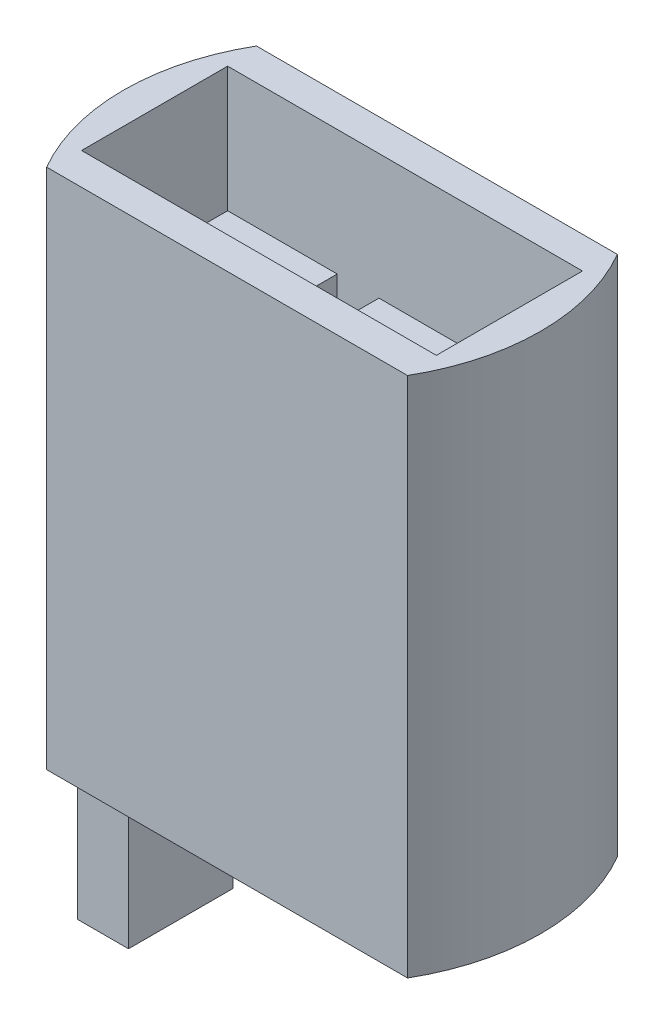
ISO-10303-21;
HEADER;
FILE_DESCRIPTION(('STEP AP214'),'2;1');
FILE_NAME('part.step','',(''),(''),'','','');
FILE_SCHEMA(('AUTOMOTIVE_DESIGN { 1 0 10303 214 1 1 1 1 }'));
ENDSEC;
DATA;
#1=APPLICATION_CONTEXT('core data for automotive mechanical design processes');
#2=APPLICATION_PROTOCOL_DEFINITION('international standard','automotive_design',2000,#1);
#3=PRODUCT_CONTEXT('',#1,'mechanical');
#4=PRODUCT('Part','Part','',(#3));
#5=PRODUCT_RELATED_PRODUCT_CATEGORY('part','',(#4));
#6=PRODUCT_DEFINITION_FORMATION('','',#4);
#7=PRODUCT_DEFINITION_CONTEXT('part definition',#1,'design');
#8=PRODUCT_DEFINITION('design','',#6,#7);
#9=PRODUCT_DEFINITION_SHAPE('','',#8);
#10=(LENGTH_UNIT() NAMED_UNIT(*) SI_UNIT(.MILLI.,.METRE.));
#11=(NAMED_UNIT(*) PLANE_ANGLE_UNIT() SI_UNIT($,.RADIAN.));
#12=(NAMED_UNIT(*) SI_UNIT($,.STERADIAN.) SOLID_ANGLE_UNIT());
#13=UNCERTAINTY_MEASURE_WITH_UNIT(LENGTH_MEASURE(1.E-05),#10,'distance_accuracy_value','');
#14=(GEOMETRIC_REPRESENTATION_CONTEXT(3) GLOBAL_UNCERTAINTY_ASSIGNED_CONTEXT((#13)) GLOBAL_UNIT_ASSIGNED_CONTEXT((#10,
#11,#12)) REPRESENTATION_CONTEXT('',''));
#15=CARTESIAN_POINT('',(0.,0.,0.));
#16=DIRECTION('',(0.,0.,1.));
#17=DIRECTION('',(1.,0.,0.));
#18=AXIS2_PLACEMENT_3D('',#15,#16,#17);
#19=CARTESIAN_POINT('',(-8.05,-8.,-2.5));
#20=DIRECTION('',(1.,0.,0.));
#21=DIRECTION('',(0.,0.,-1.));
#22=AXIS2_PLACEMENT_3D('',#19,#20,#21);
#23=PLANE('',#22);
#24=DIRECTION('',(0.,-1.,0.));
#25=VECTOR('',#24,1.);
#26=CARTESIAN_POINT('',(-8.05,-8.,1.5));
#27=LINE('',#26,#25);
#28=CARTESIAN_POINT('',(-8.05,-0.75,1.5));
#29=VERTEX_POINT('',#28);
#30=CARTESIAN_POINT('',(-8.05,-8.,1.5));
#31=VERTEX_POINT('',#30);
#32=EDGE_CURVE('E56',#29,#31,#27,.T.);
#33=ORIENTED_EDGE('',*,*,#32,.F.);
#34=DIRECTION('',(0.,0.,1.));
#35=VECTOR('',#34,1.);
#36=CARTESIAN_POINT('',(-8.05,-0.75,1.5));
#37=LINE('',#36,#35);
#38=CARTESIAN_POINT('',(-8.05,-0.75,-1.5));
#39=VERTEX_POINT('',#38);
#40=EDGE_CURVE('E464',#39,#29,#37,.T.);
#41=ORIENTED_EDGE('',*,*,#40,.F.);
#42=DIRECTION('',(0.,1.,0.));
#43=VECTOR('',#42,1.);
#44=CARTESIAN_POINT('',(-8.05,-0.75,-1.5));
#45=LINE('',#44,#43);
#46=CARTESIAN_POINT('',(-8.05,-8.,-1.5));
#47=VERTEX_POINT('',#46);
#48=EDGE_CURVE('E61',#47,#39,#45,.T.);
#49=ORIENTED_EDGE('',*,*,#48,.F.);
#50=DIRECTION('',(0.,0.,-1.));
#51=VECTOR('',#50,1.);
#52=CARTESIAN_POINT('',(-8.05,-8.,-2.5));
#53=LINE('',#52,#51);
#54=EDGE_CURVE('E203',#31,#47,#53,.T.);
#55=ORIENTED_EDGE('',*,*,#54,.F.);
#56=EDGE_LOOP('',(#33,#41,#49,#55));
#57=FACE_BOUND('',#56,.T.);
#58=ADVANCED_FACE('F41',(#57),#23,.F.);
#59=CARTESIAN_POINT('',(-8.05,-8.,-2.5));
#60=DIRECTION('',(0.,0.,1.));
#61=DIRECTION('',(1.,0.,0.));
#62=AXIS2_PLACEMENT_3D('',#59,#60,#61);
#63=PLANE('',#62);
#64=DIRECTION('',(1.,0.,0.));
#65=VECTOR('',#64,1.);
#66=CARTESIAN_POINT('',(-8.05,-8.,-2.5));
#67=LINE('',#66,#65);
#68=CARTESIAN_POINT('',(-9.68245836551854,-8.,-2.5));
#69=VERTEX_POINT('',#68);
#70=CARTESIAN_POINT('',(-7.25,-8.,-2.5));
#71=VERTEX_POINT('',#70);
#72=EDGE_CURVE('E193',#69,#71,#67,.T.);
#73=ORIENTED_EDGE('',*,*,#72,.F.);
#74=DIRECTION('',(0.,1.,0.));
#75=VECTOR('',#74,1.);
#76=CARTESIAN_POINT('',(-9.68245836551854,-8.001,-2.5));
#77=LINE('',#76,#75);
#78=CARTESIAN_POINT('',(-9.68245836551854,0.,-2.5));
#79=VERTEX_POINT('',#78);
#80=EDGE_CURVE('E176',#69,#79,#77,.T.);
#81=ORIENTED_EDGE('',*,*,#80,.T.);
#82=DIRECTION('',(1.,0.,0.));
#83=VECTOR('',#82,1.);
#84=CARTESIAN_POINT('',(-8.05,0.,-2.5));
#85=LINE('',#84,#83);
#86=CARTESIAN_POINT('',(-7.25,0.,-2.5));
#87=VERTEX_POINT('',#86);
#88=EDGE_CURVE('E214',#79,#87,#85,.T.);
#89=ORIENTED_EDGE('',*,*,#88,.T.);
#90=DIRECTION('',(0.,1.,0.));
#91=VECTOR('',#90,1.);
#92=CARTESIAN_POINT('',(-7.25,-8.,-2.5));
#93=LINE('',#92,#91);
#94=EDGE_CURVE('E11',#71,#87,#93,.T.);
#95=ORIENTED_EDGE('',*,*,#94,.F.);
#96=EDGE_LOOP('',(#73,#81,#89,#95));
#97=FACE_BOUND('',#96,.T.);
#98=ADVANCED_FACE('F199',(#97),#63,.F.);
#99=CARTESIAN_POINT('',(-7.25,-8.,-2.5));
#100=DIRECTION('',(-1.,0.,0.));
#101=DIRECTION('',(0.,0.,1.));
#102=AXIS2_PLACEMENT_3D('',#99,#100,#101);
#103=PLANE('',#102);
#104=DIRECTION('',(0.,0.,1.));
#105=VECTOR('',#104,1.);
#106=CARTESIAN_POINT('',(-7.25,0.,-2.5));
#107=LINE('',#106,#105);
#108=CARTESIAN_POINT('',(-7.25,0.,2.5));
#109=VERTEX_POINT('',#108);
#110=EDGE_CURVE('E217',#87,#109,#107,.T.);
#111=ORIENTED_EDGE('',*,*,#110,.T.);
#112=DIRECTION('',(0.,1.,0.));
#113=VECTOR('',#112,1.);
#114=CARTESIAN_POINT('',(-7.25,-8.,2.5));
#115=LINE('',#114,#113);
#116=CARTESIAN_POINT('',(-7.25,-8.,2.5));
#117=VERTEX_POINT('',#116);
#118=EDGE_CURVE('E49',#117,#109,#115,.T.);
#119=ORIENTED_EDGE('',*,*,#118,.F.);
#120=DIRECTION('',(0.,0.,1.));
#121=VECTOR('',#120,1.);
#122=CARTESIAN_POINT('',(-7.25,-8.,-2.5));
#123=LINE('',#122,#121);
#124=EDGE_CURVE('E202',#71,#117,#123,.T.);
#125=ORIENTED_EDGE('',*,*,#124,.F.);
#126=ORIENTED_EDGE('',*,*,#94,.T.);
#127=EDGE_LOOP('',(#111,#119,#125,#126));
#128=FACE_BOUND('',#127,.T.);
#129=ADVANCED_FACE('F423',(#128),#103,.F.);
#130=CARTESIAN_POINT('',(-8.05,-8.,2.5));
#131=DIRECTION('',(0.,0.,-1.));
#132=DIRECTION('',(-1.,0.,0.));
#133=AXIS2_PLACEMENT_3D('',#130,#131,#132);
#134=PLANE('',#133);
#135=DIRECTION('',(-1.,0.,0.));
#136=VECTOR('',#135,1.);
#137=CARTESIAN_POINT('',(-8.05,0.,2.5));
#138=LINE('',#137,#136);
#139=CARTESIAN_POINT('',(-9.68245836551854,0.,2.5));
#140=VERTEX_POINT('',#139);
#141=EDGE_CURVE('E208',#109,#140,#138,.T.);
#142=ORIENTED_EDGE('',*,*,#141,.T.);
#143=DIRECTION('',(0.,1.,0.));
#144=VECTOR('',#143,1.);
#145=CARTESIAN_POINT('',(-9.68245836551854,-8.001,2.5));
#146=LINE('',#145,#144);
#147=CARTESIAN_POINT('',(-9.68245836551854,-8.,2.5));
#148=VERTEX_POINT('',#147);
#149=EDGE_CURVE('E188',#148,#140,#146,.T.);
#150=ORIENTED_EDGE('',*,*,#149,.F.);
#151=DIRECTION('',(-1.,0.,0.));
#152=VECTOR('',#151,1.);
#153=CARTESIAN_POINT('',(-8.05,-8.,2.5));
#154=LINE('',#153,#152);
#155=EDGE_CURVE('E196',#117,#148,#154,.T.);
#156=ORIENTED_EDGE('',*,*,#155,.F.);
#157=ORIENTED_EDGE('',*,*,#118,.T.);
#158=EDGE_LOOP('',(#142,#150,#156,#157));
#159=FACE_BOUND('',#158,.T.);
#160=ADVANCED_FACE('F228',(#159),#134,.F.);
#161=CARTESIAN_POINT('',(0.,-8.,0.));
#162=DIRECTION('',(0.,1.,0.));
#163=DIRECTION('',(0.,0.,1.));
#164=AXIS2_PLACEMENT_3D('',#161,#162,#163);
#165=PLANE('',#164);
#166=DIRECTION('',(1.,0.,0.));
#167=VECTOR('',#166,1.);
#168=CARTESIAN_POINT('',(-9.25,-8.,-1.5));
#169=LINE('',#168,#167);
#170=CARTESIAN_POINT('',(-9.25,-8.,-1.5));
#171=VERTEX_POINT('',#170);
#172=EDGE_CURVE('E218',#171,#47,#169,.T.);
#173=ORIENTED_EDGE('',*,*,#172,.F.);
#174=DIRECTION('',(0.,0.,1.));
#175=VECTOR('',#174,1.);
#176=CARTESIAN_POINT('',(-9.25,-8.,-2.5));
#177=LINE('',#176,#175);
#178=CARTESIAN_POINT('',(-9.25,-8.,1.5));
#179=VERTEX_POINT('',#178);
#180=EDGE_CURVE('E265',#171,#179,#177,.T.);
#181=ORIENTED_EDGE('',*,*,#180,.T.);
#182=DIRECTION('',(1.,0.,0.));
#183=VECTOR('',#182,1.);
#184=CARTESIAN_POINT('',(-9.25,-8.,1.5));
#185=LINE('',#184,#183);
#186=EDGE_CURVE('E473',#179,#31,#185,.T.);
#187=ORIENTED_EDGE('',*,*,#186,.T.);
#188=ORIENTED_EDGE('',*,*,#54,.T.);
#189=EDGE_LOOP('',(#173,#181,#187,#188));
#190=FACE_BOUND('',#189,.T.);
#191=ORIENTED_EDGE('',*,*,#155,.T.);
#192=CARTESIAN_POINT('',(-6.26235174827627E-13,-8.,0.));
#193=DIRECTION('',(0.,1.,0.));
#194=DIRECTION('',(0.,0.,1.));
#195=AXIS2_PLACEMENT_3D('',#192,#193,#194);
#196=CIRCLE('',#195,9.99999999999939);
#197=EDGE_CURVE('E179',#69,#148,#196,.T.);
#198=ORIENTED_EDGE('',*,*,#197,.F.);
#199=ORIENTED_EDGE('',*,*,#72,.T.);
#200=ORIENTED_EDGE('',*,*,#124,.T.);
#201=EDGE_LOOP('',(#191,#198,#199,#200));
#202=FACE_BOUND('',#201,.T.);
#203=ADVANCED_FACE('F192',(#190,#202),#165,.F.);
#204=CARTESIAN_POINT('',(-9.25,-0.75,-1.5));
#205=DIRECTION('',(0.,0.,-1.));
#206=DIRECTION('',(0.,1.,0.));
#207=AXIS2_PLACEMENT_3D('',#204,#205,#206);
#208=PLANE('',#207);
#209=ORIENTED_EDGE('',*,*,#48,.T.);
#210=DIRECTION('',(1.,0.,0.));
#211=VECTOR('',#210,1.);
#212=CARTESIAN_POINT('',(-9.25,-0.75,-1.5));
#213=LINE('',#212,#211);
#214=CARTESIAN_POINT('',(-9.25,-0.75,-1.5));
#215=VERTEX_POINT('',#214);
#216=EDGE_CURVE('E485',#215,#39,#213,.T.);
#217=ORIENTED_EDGE('',*,*,#216,.F.);
#218=DIRECTION('',(0.,1.,0.));
#219=VECTOR('',#218,1.);
#220=CARTESIAN_POINT('',(-9.25,-0.75,-1.5));
#221=LINE('',#220,#219);
#222=EDGE_CURVE('E457',#171,#215,#221,.T.);
#223=ORIENTED_EDGE('',*,*,#222,.F.);
#224=ORIENTED_EDGE('',*,*,#172,.T.);
#225=EDGE_LOOP('',(#209,#217,#223,#224));
#226=FACE_BOUND('',#225,.T.);
#227=ADVANCED_FACE('F433',(#226),#208,.F.);
#228=CARTESIAN_POINT('',(-9.25,-0.75,1.5));
#229=DIRECTION('',(0.,1.,0.));
#230=DIRECTION('',(0.,0.,1.));
#231=AXIS2_PLACEMENT_3D('',#228,#229,#230);
#232=PLANE('',#231);
#233=ORIENTED_EDGE('',*,*,#40,.T.);
#234=DIRECTION('',(1.,0.,0.));
#235=VECTOR('',#234,1.);
#236=CARTESIAN_POINT('',(-9.25,-0.75,1.5));
#237=LINE('',#236,#235);
#238=CARTESIAN_POINT('',(-9.25,-0.75,1.5));
#239=VERTEX_POINT('',#238);
#240=EDGE_CURVE('E481',#239,#29,#237,.T.);
#241=ORIENTED_EDGE('',*,*,#240,.F.);
#242=DIRECTION('',(0.,0.,1.));
#243=VECTOR('',#242,1.);
#244=CARTESIAN_POINT('',(-9.25,-0.75,1.5));
#245=LINE('',#244,#243);
#246=EDGE_CURVE('E469',#215,#239,#245,.T.);
#247=ORIENTED_EDGE('',*,*,#246,.F.);
#248=ORIENTED_EDGE('',*,*,#216,.T.);
#249=EDGE_LOOP('',(#233,#241,#247,#248));
#250=FACE_BOUND('',#249,.T.);
#251=ADVANCED_FACE('F437',(#250),#232,.F.);
#252=CARTESIAN_POINT('',(-9.25,-8.,1.5));
#253=DIRECTION('',(0.,0.,1.));
#254=DIRECTION('',(1.,0.,0.));
#255=AXIS2_PLACEMENT_3D('',#252,#253,#254);
#256=PLANE('',#255);
#257=ORIENTED_EDGE('',*,*,#32,.T.);
#258=ORIENTED_EDGE('',*,*,#186,.F.);
#259=DIRECTION('',(0.,-1.,0.));
#260=VECTOR('',#259,1.);
#261=CARTESIAN_POINT('',(-9.25,-8.,1.5));
#262=LINE('',#261,#260);
#263=EDGE_CURVE('E459',#239,#179,#262,.T.);
#264=ORIENTED_EDGE('',*,*,#263,.F.);
#265=ORIENTED_EDGE('',*,*,#240,.T.);
#266=EDGE_LOOP('',(#257,#258,#264,#265));
#267=FACE_BOUND('',#266,.T.);
#268=ADVANCED_FACE('F441',(#267),#256,.F.);
#269=CARTESIAN_POINT('',(-9.25,0.,0.));
#270=DIRECTION('',(1.,0.,0.));
#271=DIRECTION('',(0.,0.,-1.));
#272=AXIS2_PLACEMENT_3D('',#269,#270,#271);
#273=PLANE('',#272);
#274=ORIENTED_EDGE('',*,*,#180,.F.);
#275=ORIENTED_EDGE('',*,*,#222,.T.);
#276=ORIENTED_EDGE('',*,*,#246,.T.);
#277=ORIENTED_EDGE('',*,*,#263,.T.);
#278=EDGE_LOOP('',(#274,#275,#276,#277));
#279=FACE_BOUND('',#278,.T.);
#280=ADVANCED_FACE('F445',(#279),#273,.T.);
#281=CARTESIAN_POINT('',(0.,25.,0.));
#282=DIRECTION('',(0.,-1.,0.));
#283=DIRECTION('',(0.,0.,-1.));
#284=AXIS2_PLACEMENT_3D('',#281,#282,#283);
#285=CYLINDRICAL_SURFACE('',#284,10.);
#286=CARTESIAN_POINT('',(0.,25.,0.));
#287=DIRECTION('',(0.,1.,0.));
#288=DIRECTION('',(0.,0.,1.));
#289=AXIS2_PLACEMENT_3D('',#286,#287,#288);
#290=CIRCLE('',#289,10.);
#291=CARTESIAN_POINT('',(8.64463271574625,25.,5.02695983770008));
#292=VERTEX_POINT('',#291);
#293=CARTESIAN_POINT('',(8.64463271574627,25.,-5.02695983770008));
#294=VERTEX_POINT('',#293);
#295=EDGE_CURVE('E258',#292,#294,#290,.T.);
#296=ORIENTED_EDGE('',*,*,#295,.F.);
#297=DIRECTION('',(0.,-1.,0.));
#298=VECTOR('',#297,1.);
#299=CARTESIAN_POINT('',(8.64463271574625,25.,5.02695983770008));
#300=LINE('',#299,#298);
#301=CARTESIAN_POINT('',(8.64463271574625,0.,5.02695983770008));
#302=VERTEX_POINT('',#301);
#303=EDGE_CURVE('E331',#292,#302,#300,.T.);
#304=ORIENTED_EDGE('',*,*,#303,.T.);
#305=CARTESIAN_POINT('',(0.,0.,0.));
#306=DIRECTION('',(0.,1.,0.));
#307=DIRECTION('',(0.,0.,1.));
#308=AXIS2_PLACEMENT_3D('',#305,#306,#307);
#309=CIRCLE('',#308,10.);
#310=CARTESIAN_POINT('',(8.64463271574625,0.,-5.02695983770008));
#311=VERTEX_POINT('',#310);
#312=EDGE_CURVE('E243',#302,#311,#309,.T.);
#313=ORIENTED_EDGE('',*,*,#312,.T.);
#314=DIRECTION('',(0.,-1.,0.));
#315=VECTOR('',#314,1.);
#316=CARTESIAN_POINT('',(8.64463271574627,25.,-5.02695983770008));
#317=LINE('',#316,#315);
#318=EDGE_CURVE('E346',#294,#311,#317,.T.);
#319=ORIENTED_EDGE('',*,*,#318,.F.);
#320=EDGE_LOOP('',(#296,#304,#313,#319));
#321=FACE_BOUND('',#320,.T.);
#322=ADVANCED_FACE('F417',(#321),#285,.T.);
#323=CARTESIAN_POINT('',(0.,19.,0.));
#324=DIRECTION('',(0.,-1.,0.));
#325=DIRECTION('',(0.,0.,-1.));
#326=AXIS2_PLACEMENT_3D('',#323,#324,#325);
#327=PLANE('',#326);
#328=DIRECTION('',(0.,0.,-1.));
#329=VECTOR('',#328,1.);
#330=CARTESIAN_POINT('',(-1.25,19.,-3.5));
#331=LINE('',#330,#329);
#332=CARTESIAN_POINT('',(-1.25,19.,3.5));
#333=VERTEX_POINT('',#332);
#334=CARTESIAN_POINT('',(-1.25,19.,-3.5));
#335=VERTEX_POINT('',#334);
#336=EDGE_CURVE('E327',#333,#335,#331,.T.);
#337=ORIENTED_EDGE('',*,*,#336,.F.);
#338=DIRECTION('',(1.,0.,0.));
#339=VECTOR('',#338,1.);
#340=CARTESIAN_POINT('',(-8.5,19.,3.5));
#341=LINE('',#340,#339);
#342=CARTESIAN_POINT('',(8.5,19.,3.5));
#343=VERTEX_POINT('',#342);
#344=EDGE_CURVE('E306',#333,#343,#341,.T.);
#345=ORIENTED_EDGE('',*,*,#344,.T.);
#346=DIRECTION('',(0.,0.,-1.));
#347=VECTOR('',#346,1.);
#348=CARTESIAN_POINT('',(8.5,19.,3.5));
#349=LINE('',#348,#347);
#350=CARTESIAN_POINT('',(8.5,19.,-3.5));
#351=VERTEX_POINT('',#350);
#352=EDGE_CURVE('E298',#343,#351,#349,.T.);
#353=ORIENTED_EDGE('',*,*,#352,.T.);
#354=DIRECTION('',(-1.,0.,0.));
#355=VECTOR('',#354,1.);
#356=CARTESIAN_POINT('',(-8.5,19.,-3.5));
#357=LINE('',#356,#355);
#358=EDGE_CURVE('E272',#351,#335,#357,.T.);
#359=ORIENTED_EDGE('',*,*,#358,.T.);
#360=EDGE_LOOP('',(#337,#345,#353,#359));
#361=FACE_BOUND('',#360,.T.);
#362=ADVANCED_FACE('F401',(#361),#327,.F.);
#363=DIRECTION('',(0.,0.,1.));
#364=VECTOR('',#363,1.);
#365=CARTESIAN_POINT('',(-3.25,19.,-3.5));
#366=LINE('',#365,#364);
#367=CARTESIAN_POINT('',(-3.25,19.,-3.5));
#368=VERTEX_POINT('',#367);
#369=CARTESIAN_POINT('',(-3.25,19.,3.5));
#370=VERTEX_POINT('',#369);
#371=EDGE_CURVE('E322',#368,#370,#366,.T.);
#372=ORIENTED_EDGE('',*,*,#371,.F.);
#373=CARTESIAN_POINT('',(-8.5,19.,-3.5));
#374=VERTEX_POINT('',#373);
#375=EDGE_CURVE('E297',#368,#374,#357,.T.);
#376=ORIENTED_EDGE('',*,*,#375,.T.);
#377=DIRECTION('',(0.,0.,1.));
#378=VECTOR('',#377,1.);
#379=CARTESIAN_POINT('',(-8.5,19.,3.5));
#380=LINE('',#379,#378);
#381=CARTESIAN_POINT('',(-8.5,19.,3.5));
#382=VERTEX_POINT('',#381);
#383=EDGE_CURVE('E281',#374,#382,#380,.T.);
#384=ORIENTED_EDGE('',*,*,#383,.T.);
#385=EDGE_CURVE('E302',#382,#370,#341,.T.);
#386=ORIENTED_EDGE('',*,*,#385,.T.);
#387=EDGE_LOOP('',(#372,#376,#384,#386));
#388=FACE_BOUND('',#387,.T.);
#389=ADVANCED_FACE('F375',(#388),#327,.F.);
#390=CARTESIAN_POINT('',(-8.64463271574623,0.,-5.02695983770015));
#391=VERTEX_POINT('',#390);
#392=EDGE_CURVE('E183',#391,#79,#309,.T.);
#393=ORIENTED_EDGE('',*,*,#392,.T.);
#394=ORIENTED_EDGE('',*,*,#80,.F.);
#395=ORIENTED_EDGE('',*,*,#197,.T.);
#396=ORIENTED_EDGE('',*,*,#149,.T.);
#397=CARTESIAN_POINT('',(-8.64463271574625,0.,5.02695983770008));
#398=VERTEX_POINT('',#397);
#399=EDGE_CURVE('E235',#140,#398,#309,.T.);
#400=ORIENTED_EDGE('',*,*,#399,.T.);
#401=DIRECTION('',(0.,-1.,0.));
#402=VECTOR('',#401,1.);
#403=CARTESIAN_POINT('',(-8.64463271574625,25.,5.02695983770008));
#404=LINE('',#403,#402);
#405=CARTESIAN_POINT('',(-8.64463271574625,25.,5.02695983770008));
#406=VERTEX_POINT('',#405);
#407=EDGE_CURVE('E358',#406,#398,#404,.T.);
#408=ORIENTED_EDGE('',*,*,#407,.F.);
#409=CARTESIAN_POINT('',(-8.64463271574623,25.,-5.02695983770015));
#410=VERTEX_POINT('',#409);
#411=EDGE_CURVE('E252',#410,#406,#290,.T.);
#412=ORIENTED_EDGE('',*,*,#411,.F.);
#413=DIRECTION('',(0.,-1.,0.));
#414=VECTOR('',#413,1.);
#415=CARTESIAN_POINT('',(-8.64463271574623,25.,-5.02695983770015));
#416=LINE('',#415,#414);
#417=EDGE_CURVE('E349',#410,#391,#416,.T.);
#418=ORIENTED_EDGE('',*,*,#417,.T.);
#419=EDGE_LOOP('',(#393,#394,#395,#396,#400,#408,#412,#418));
#420=FACE_BOUND('',#419,.T.);
#421=ADVANCED_FACE('F178',(#420),#285,.T.);
#422=CARTESIAN_POINT('',(0.,25.,0.));
#423=DIRECTION('',(0.,1.,0.));
#424=DIRECTION('',(0.,0.,1.));
#425=AXIS2_PLACEMENT_3D('',#422,#423,#424);
#426=PLANE('',#425);
#427=DIRECTION('',(1.,0.,0.));
#428=VECTOR('',#427,1.);
#429=CARTESIAN_POINT('',(-8.64463271574625,25.,5.02695983770008));
#430=LINE('',#429,#428);
#431=EDGE_CURVE('E361',#406,#292,#430,.T.);
#432=ORIENTED_EDGE('',*,*,#431,.T.);
#433=ORIENTED_EDGE('',*,*,#295,.T.);
#434=DIRECTION('',(-1.,0.,0.));
#435=VECTOR('',#434,1.);
#436=CARTESIAN_POINT('',(-8.64463271574623,25.,-5.02695983770015));
#437=LINE('',#436,#435);
#438=EDGE_CURVE('E350',#294,#410,#437,.T.);
#439=ORIENTED_EDGE('',*,*,#438,.T.);
#440=ORIENTED_EDGE('',*,*,#411,.T.);
#441=EDGE_LOOP('',(#432,#433,#439,#440));
#442=FACE_BOUND('',#441,.T.);
#443=DIRECTION('',(0.,0.,1.));
#444=VECTOR('',#443,1.);
#445=CARTESIAN_POINT('',(-8.5,25.,3.5));
#446=LINE('',#445,#444);
#447=CARTESIAN_POINT('',(-8.5,25.,-3.5));
#448=VERTEX_POINT('',#447);
#449=CARTESIAN_POINT('',(-8.5,25.,3.5));
#450=VERTEX_POINT('',#449);
#451=EDGE_CURVE('E290',#448,#450,#446,.T.);
#452=ORIENTED_EDGE('',*,*,#451,.F.);
#453=DIRECTION('',(-1.,0.,0.));
#454=VECTOR('',#453,1.);
#455=CARTESIAN_POINT('',(-8.5,25.,-3.5));
#456=LINE('',#455,#454);
#457=CARTESIAN_POINT('',(8.5,25.,-3.5));
#458=VERTEX_POINT('',#457);
#459=EDGE_CURVE('E277',#458,#448,#456,.T.);
#460=ORIENTED_EDGE('',*,*,#459,.F.);
#461=DIRECTION('',(0.,0.,-1.));
#462=VECTOR('',#461,1.);
#463=CARTESIAN_POINT('',(8.5,25.,3.5));
#464=LINE('',#463,#462);
#465=CARTESIAN_POINT('',(8.5,25.,3.5));
#466=VERTEX_POINT('',#465);
#467=EDGE_CURVE('E282',#466,#458,#464,.T.);
#468=ORIENTED_EDGE('',*,*,#467,.F.);
#469=DIRECTION('',(1.,0.,0.));
#470=VECTOR('',#469,1.);
#471=CARTESIAN_POINT('',(-8.5,25.,3.5));
#472=LINE('',#471,#470);
#473=EDGE_CURVE('E286',#450,#466,#472,.T.);
#474=ORIENTED_EDGE('',*,*,#473,.F.);
#475=EDGE_LOOP('',(#452,#460,#468,#474));
#476=FACE_BOUND('',#475,.T.);
#477=ADVANCED_FACE('F408',(#442,#476),#426,.T.);
#478=CARTESIAN_POINT('',(0.,0.,0.));
#479=DIRECTION('',(0.,1.,0.));
#480=DIRECTION('',(0.,0.,1.));
#481=AXIS2_PLACEMENT_3D('',#478,#479,#480);
#482=PLANE('',#481);
#483=ORIENTED_EDGE('',*,*,#88,.F.);
#484=ORIENTED_EDGE('',*,*,#392,.F.);
#485=DIRECTION('',(-1.,0.,0.));
#486=VECTOR('',#485,1.);
#487=CARTESIAN_POINT('',(-8.64463271574623,0.,-5.02695983770015));
#488=LINE('',#487,#486);
#489=EDGE_CURVE('E353',#311,#391,#488,.T.);
#490=ORIENTED_EDGE('',*,*,#489,.F.);
#491=ORIENTED_EDGE('',*,*,#312,.F.);
#492=DIRECTION('',(1.,0.,0.));
#493=VECTOR('',#492,1.);
#494=CARTESIAN_POINT('',(-8.64463271574625,0.,5.02695983770008));
#495=LINE('',#494,#493);
#496=EDGE_CURVE('E237',#398,#302,#495,.T.);
#497=ORIENTED_EDGE('',*,*,#496,.F.);
#498=ORIENTED_EDGE('',*,*,#399,.F.);
#499=ORIENTED_EDGE('',*,*,#141,.F.);
#500=ORIENTED_EDGE('',*,*,#110,.F.);
#501=EDGE_LOOP('',(#483,#484,#490,#491,#497,#498,#499,#500));
#502=FACE_BOUND('',#501,.T.);
#503=ADVANCED_FACE('F233',(#502),#482,.F.);
#504=CARTESIAN_POINT('',(-8.5,19.,3.5));
#505=DIRECTION('',(-1.,0.,0.));
#506=DIRECTION('',(0.,0.,1.));
#507=AXIS2_PLACEMENT_3D('',#504,#505,#506);
#508=PLANE('',#507);
#509=ORIENTED_EDGE('',*,*,#451,.T.);
#510=DIRECTION('',(0.,1.,0.));
#511=VECTOR('',#510,1.);
#512=CARTESIAN_POINT('',(-8.5,19.,3.5));
#513=LINE('',#512,#511);
#514=EDGE_CURVE('E267',#382,#450,#513,.T.);
#515=ORIENTED_EDGE('',*,*,#514,.F.);
#516=ORIENTED_EDGE('',*,*,#383,.F.);
#517=DIRECTION('',(0.,1.,0.));
#518=VECTOR('',#517,1.);
#519=CARTESIAN_POINT('',(-8.5,19.,-3.5));
#520=LINE('',#519,#518);
#521=EDGE_CURVE('E241',#374,#448,#520,.T.);
#522=ORIENTED_EDGE('',*,*,#521,.T.);
#523=EDGE_LOOP('',(#509,#515,#516,#522));
#524=FACE_BOUND('',#523,.T.);
#525=ADVANCED_FACE('F382',(#524),#508,.F.);
#526=CARTESIAN_POINT('',(-8.5,19.,-3.5));
#527=DIRECTION('',(0.,0.,-1.));
#528=DIRECTION('',(-1.,0.,0.));
#529=AXIS2_PLACEMENT_3D('',#526,#527,#528);
#530=PLANE('',#529);
#531=ORIENTED_EDGE('',*,*,#459,.T.);
#532=ORIENTED_EDGE('',*,*,#521,.F.);
#533=ORIENTED_EDGE('',*,*,#375,.F.);
#534=DIRECTION('',(0.,1.,0.));
#535=VECTOR('',#534,1.);
#536=CARTESIAN_POINT('',(-3.25,15.,-3.5));
#537=LINE('',#536,#535);
#538=CARTESIAN_POINT('',(-3.25,15.,-3.5));
#539=VERTEX_POINT('',#538);
#540=EDGE_CURVE('E313',#539,#368,#537,.T.);
#541=ORIENTED_EDGE('',*,*,#540,.F.);
#542=DIRECTION('',(-1.,0.,0.));
#543=VECTOR('',#542,1.);
#544=CARTESIAN_POINT('',(-1.25,15.,-3.5));
#545=LINE('',#544,#543);
#546=CARTESIAN_POINT('',(-1.25,15.,-3.5));
#547=VERTEX_POINT('',#546);
#548=EDGE_CURVE('E339',#547,#539,#545,.T.);
#549=ORIENTED_EDGE('',*,*,#548,.F.);
#550=DIRECTION('',(0.,1.,0.));
#551=VECTOR('',#550,1.);
#552=CARTESIAN_POINT('',(-1.25,15.,-3.5));
#553=LINE('',#552,#551);
#554=EDGE_CURVE('E310',#547,#335,#553,.T.);
#555=ORIENTED_EDGE('',*,*,#554,.T.);
#556=ORIENTED_EDGE('',*,*,#358,.F.);
#557=DIRECTION('',(0.,1.,0.));
#558=VECTOR('',#557,1.);
#559=CARTESIAN_POINT('',(8.5,19.,-3.5));
#560=LINE('',#559,#558);
#561=EDGE_CURVE('E246',#351,#458,#560,.T.);
#562=ORIENTED_EDGE('',*,*,#561,.T.);
#563=EDGE_LOOP('',(#531,#532,#533,#541,#549,#555,#556,#562));
#564=FACE_BOUND('',#563,.T.);
#565=ADVANCED_FACE('F378',(#564),#530,.F.);
#566=CARTESIAN_POINT('',(8.5,19.,3.5));
#567=DIRECTION('',(1.,0.,0.));
#568=DIRECTION('',(0.,0.,-1.));
#569=AXIS2_PLACEMENT_3D('',#566,#567,#568);
#570=PLANE('',#569);
#571=ORIENTED_EDGE('',*,*,#467,.T.);
#572=ORIENTED_EDGE('',*,*,#561,.F.);
#573=ORIENTED_EDGE('',*,*,#352,.F.);
#574=DIRECTION('',(0.,1.,0.));
#575=VECTOR('',#574,1.);
#576=CARTESIAN_POINT('',(8.5,19.,3.5));
#577=LINE('',#576,#575);
#578=EDGE_CURVE('E271',#343,#466,#577,.T.);
#579=ORIENTED_EDGE('',*,*,#578,.T.);
#580=EDGE_LOOP('',(#571,#572,#573,#579));
#581=FACE_BOUND('',#580,.T.);
#582=ADVANCED_FACE('F405',(#581),#570,.F.);
#583=CARTESIAN_POINT('',(-8.5,19.,3.5));
#584=DIRECTION('',(0.,0.,1.));
#585=DIRECTION('',(1.,0.,0.));
#586=AXIS2_PLACEMENT_3D('',#583,#584,#585);
#587=PLANE('',#586);
#588=ORIENTED_EDGE('',*,*,#473,.T.);
#589=ORIENTED_EDGE('',*,*,#578,.F.);
#590=ORIENTED_EDGE('',*,*,#344,.F.);
#591=DIRECTION('',(0.,1.,0.));
#592=VECTOR('',#591,1.);
#593=CARTESIAN_POINT('',(-1.25,15.,3.5));
#594=LINE('',#593,#592);
#595=CARTESIAN_POINT('',(-1.25,15.,3.5));
#596=VERTEX_POINT('',#595);
#597=EDGE_CURVE('E293',#596,#333,#594,.T.);
#598=ORIENTED_EDGE('',*,*,#597,.F.);
#599=DIRECTION('',(1.,0.,0.));
#600=VECTOR('',#599,1.);
#601=CARTESIAN_POINT('',(-1.25,15.,3.5));
#602=LINE('',#601,#600);
#603=CARTESIAN_POINT('',(-3.25,15.,3.5));
#604=VERTEX_POINT('',#603);
#605=EDGE_CURVE('E314',#604,#596,#602,.T.);
#606=ORIENTED_EDGE('',*,*,#605,.F.);
#607=DIRECTION('',(0.,1.,0.));
#608=VECTOR('',#607,1.);
#609=CARTESIAN_POINT('',(-3.25,15.,3.5));
#610=LINE('',#609,#608);
#611=EDGE_CURVE('E317',#604,#370,#610,.T.);
#612=ORIENTED_EDGE('',*,*,#611,.T.);
#613=ORIENTED_EDGE('',*,*,#385,.F.);
#614=ORIENTED_EDGE('',*,*,#514,.T.);
#615=EDGE_LOOP('',(#588,#589,#590,#598,#606,#612,#613,#614));
#616=FACE_BOUND('',#615,.T.);
#617=ADVANCED_FACE('F386',(#616),#587,.F.);
#618=CARTESIAN_POINT('',(-1.25,15.,-3.5));
#619=DIRECTION('',(1.,0.,0.));
#620=DIRECTION('',(0.,0.,-1.));
#621=AXIS2_PLACEMENT_3D('',#618,#619,#620);
#622=PLANE('',#621);
#623=ORIENTED_EDGE('',*,*,#336,.T.);
#624=ORIENTED_EDGE('',*,*,#554,.F.);
#625=DIRECTION('',(0.,0.,-1.));
#626=VECTOR('',#625,1.);
#627=CARTESIAN_POINT('',(-1.25,15.,-3.5));
#628=LINE('',#627,#626);
#629=EDGE_CURVE('E326',#596,#547,#628,.T.);
#630=ORIENTED_EDGE('',*,*,#629,.F.);
#631=ORIENTED_EDGE('',*,*,#597,.T.);
#632=EDGE_LOOP('',(#623,#624,#630,#631));
#633=FACE_BOUND('',#632,.T.);
#634=ADVANCED_FACE('F397',(#633),#622,.F.);
#635=CARTESIAN_POINT('',(-3.25,15.,-3.5));
#636=DIRECTION('',(-1.,0.,0.));
#637=DIRECTION('',(0.,0.,1.));
#638=AXIS2_PLACEMENT_3D('',#635,#636,#637);
#639=PLANE('',#638);
#640=ORIENTED_EDGE('',*,*,#371,.T.);
#641=ORIENTED_EDGE('',*,*,#611,.F.);
#642=DIRECTION('',(0.,0.,1.));
#643=VECTOR('',#642,1.);
#644=CARTESIAN_POINT('',(-3.25,15.,-3.5));
#645=LINE('',#644,#643);
#646=EDGE_CURVE('E335',#539,#604,#645,.T.);
#647=ORIENTED_EDGE('',*,*,#646,.F.);
#648=ORIENTED_EDGE('',*,*,#540,.T.);
#649=EDGE_LOOP('',(#640,#641,#647,#648));
#650=FACE_BOUND('',#649,.T.);
#651=ADVANCED_FACE('F390',(#650),#639,.F.);
#652=CARTESIAN_POINT('',(0.,15.,0.));
#653=DIRECTION('',(0.,-1.,0.));
#654=DIRECTION('',(0.,0.,-1.));
#655=AXIS2_PLACEMENT_3D('',#652,#653,#654);
#656=PLANE('',#655);
#657=ORIENTED_EDGE('',*,*,#629,.T.);
#658=ORIENTED_EDGE('',*,*,#548,.T.);
#659=ORIENTED_EDGE('',*,*,#646,.T.);
#660=ORIENTED_EDGE('',*,*,#605,.T.);
#661=EDGE_LOOP('',(#657,#658,#659,#660));
#662=FACE_BOUND('',#661,.T.);
#663=ADVANCED_FACE('F395',(#662),#656,.F.);
#664=CARTESIAN_POINT('',(-8.64463271574623,25.,-5.02695983770015));
#665=DIRECTION('',(0.,0.,1.));
#666=DIRECTION('',(1.,0.,0.));
#667=AXIS2_PLACEMENT_3D('',#664,#665,#666);
#668=PLANE('',#667);
#669=ORIENTED_EDGE('',*,*,#489,.T.);
#670=ORIENTED_EDGE('',*,*,#417,.F.);
#671=ORIENTED_EDGE('',*,*,#438,.F.);
#672=ORIENTED_EDGE('',*,*,#318,.T.);
#673=EDGE_LOOP('',(#669,#670,#671,#672));
#674=FACE_BOUND('',#673,.T.);
#675=ADVANCED_FACE('F500',(#674),#668,.F.);
#676=CARTESIAN_POINT('',(-8.64463271574625,25.,5.02695983770008));
#677=DIRECTION('',(0.,0.,-1.));
#678=DIRECTION('',(-1.,0.,0.));
#679=AXIS2_PLACEMENT_3D('',#676,#677,#678);
#680=PLANE('',#679);
#681=ORIENTED_EDGE('',*,*,#496,.T.);
#682=ORIENTED_EDGE('',*,*,#303,.F.);
#683=ORIENTED_EDGE('',*,*,#431,.F.);
#684=ORIENTED_EDGE('',*,*,#407,.T.);
#685=EDGE_LOOP('',(#681,#682,#683,#684));
#686=FACE_BOUND('',#685,.T.);
#687=ADVANCED_FACE('F497',(#686),#680,.F.);
#688=CLOSED_SHELL('',(#58,#98,#129,#160,#203,#227,#251,#268,#280,#322,#362,#389,#421,#477,#503,
#525,#565,#582,#617,#634,#651,#663,#675,#687));
#689=MANIFOLD_SOLID_BREP('B2',#688);
#690=ADVANCED_BREP_SHAPE_REPRESENTATION('',(#18,#689),#14);
#691=SHAPE_DEFINITION_REPRESENTATION(#9,#690);
ENDSEC;
END-ISO-10303-21;
